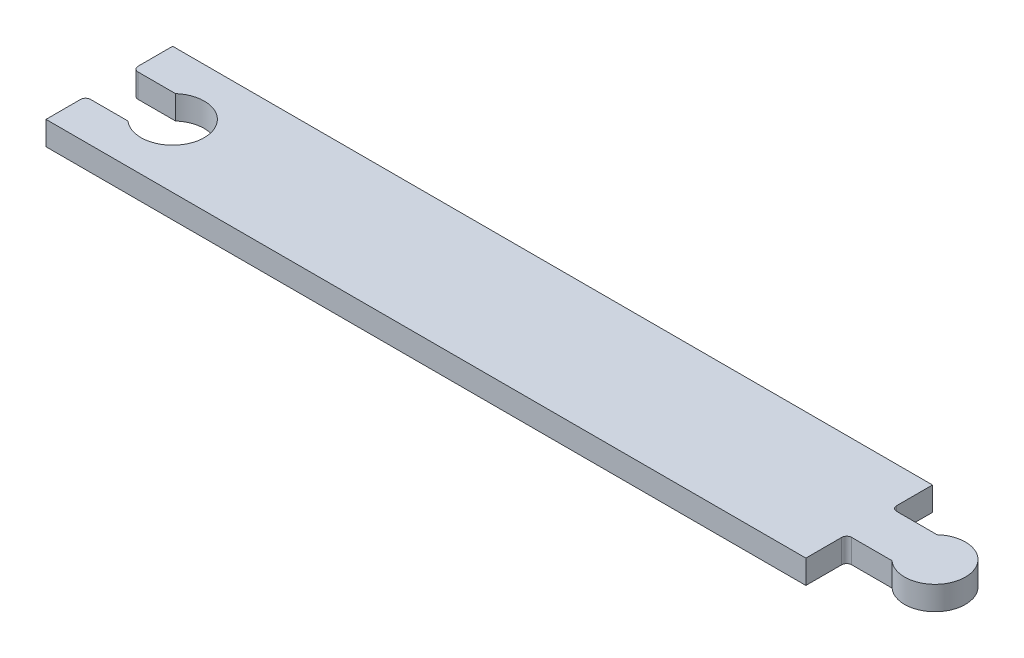
ISO-10303-21;
HEADER;
FILE_DESCRIPTION(('STEP AP214'),'2;1');
FILE_NAME('part.step','',(''),(''),'','','');
FILE_SCHEMA(('AUTOMOTIVE_DESIGN { 1 0 10303 214 1 1 1 1 }'));
ENDSEC;
DATA;
#1=APPLICATION_CONTEXT('core data for automotive mechanical design processes');
#2=APPLICATION_PROTOCOL_DEFINITION('international standard','automotive_design',2000,#1);
#3=PRODUCT_CONTEXT('',#1,'mechanical');
#4=PRODUCT('Part','Part','',(#3));
#5=PRODUCT_RELATED_PRODUCT_CATEGORY('part','',(#4));
#6=PRODUCT_DEFINITION_FORMATION('','',#4);
#7=PRODUCT_DEFINITION_CONTEXT('part definition',#1,'design');
#8=PRODUCT_DEFINITION('design','',#6,#7);
#9=PRODUCT_DEFINITION_SHAPE('','',#8);
#10=(LENGTH_UNIT() NAMED_UNIT(*) SI_UNIT(.MILLI.,.METRE.));
#11=(NAMED_UNIT(*) PLANE_ANGLE_UNIT() SI_UNIT($,.RADIAN.));
#12=(NAMED_UNIT(*) SI_UNIT($,.STERADIAN.) SOLID_ANGLE_UNIT());
#13=UNCERTAINTY_MEASURE_WITH_UNIT(LENGTH_MEASURE(1.E-05),#10,'distance_accuracy_value','');
#14=(GEOMETRIC_REPRESENTATION_CONTEXT(3) GLOBAL_UNCERTAINTY_ASSIGNED_CONTEXT((#13)) GLOBAL_UNIT_ASSIGNED_CONTEXT((#10,
#11,#12)) REPRESENTATION_CONTEXT('',''));
#15=CARTESIAN_POINT('',(0.,0.,0.));
#16=DIRECTION('',(0.,0.,1.));
#17=DIRECTION('',(1.,0.,0.));
#18=AXIS2_PLACEMENT_3D('',#15,#16,#17);
#19=CARTESIAN_POINT('',(76.2,4.7625,-4.5125));
#20=DIRECTION('',(-1.,0.,0.));
#21=DIRECTION('',(0.,0.,1.));
#22=AXIS2_PLACEMENT_3D('',#19,#20,#21);
#23=PLANE('',#22);
#24=DIRECTION('',(0.,0.,-1.));
#25=VECTOR('',#24,1.);
#26=CARTESIAN_POINT('',(76.2,4.7625,-4.5125));
#27=LINE('',#26,#25);
#28=CARTESIAN_POINT('',(76.2,4.7625,-5.5125));
#29=VERTEX_POINT('',#28);
#30=CARTESIAN_POINT('',(76.2,4.7625,-12.7));
#31=VERTEX_POINT('',#30);
#32=EDGE_CURVE('E145',#29,#31,#27,.T.);
#33=ORIENTED_EDGE('',*,*,#32,.F.);
#34=DIRECTION('',(0.,-1.,0.));
#35=VECTOR('',#34,1.);
#36=CARTESIAN_POINT('',(76.2,0.,-5.5125));
#37=LINE('',#36,#35);
#38=CARTESIAN_POINT('',(76.2,0.,-5.5125));
#39=VERTEX_POINT('',#38);
#40=EDGE_CURVE('E195',#29,#39,#37,.T.);
#41=ORIENTED_EDGE('',*,*,#40,.T.);
#42=DIRECTION('',(0.,0.,-1.));
#43=VECTOR('',#42,1.);
#44=CARTESIAN_POINT('',(76.2,0.,-4.5125));
#45=LINE('',#44,#43);
#46=CARTESIAN_POINT('',(76.2,0.,-12.7));
#47=VERTEX_POINT('',#46);
#48=EDGE_CURVE('E170',#39,#47,#45,.T.);
#49=ORIENTED_EDGE('',*,*,#48,.T.);
#50=DIRECTION('',(0.,-1.,0.));
#51=VECTOR('',#50,1.);
#52=CARTESIAN_POINT('',(76.2,4.7625,-12.7));
#53=LINE('',#52,#51);
#54=EDGE_CURVE('E163',#31,#47,#53,.T.);
#55=ORIENTED_EDGE('',*,*,#54,.F.);
#56=EDGE_LOOP('',(#33,#41,#49,#55));
#57=FACE_BOUND('',#56,.T.);
#58=ADVANCED_FACE('F33',(#57),#23,.F.);
#59=CARTESIAN_POINT('',(-76.2,4.7625,-12.7));
#60=DIRECTION('',(0.,0.,1.));
#61=DIRECTION('',(1.,0.,0.));
#62=AXIS2_PLACEMENT_3D('',#59,#60,#61);
#63=PLANE('',#62);
#64=DIRECTION('',(-1.,0.,0.));
#65=VECTOR('',#64,1.);
#66=CARTESIAN_POINT('',(-76.2,0.,-12.7));
#67=LINE('',#66,#65);
#68=CARTESIAN_POINT('',(-76.2,0.,-12.7));
#69=VERTEX_POINT('',#68);
#70=EDGE_CURVE('E245',#47,#69,#67,.T.);
#71=ORIENTED_EDGE('',*,*,#70,.T.);
#72=DIRECTION('',(0.,-1.,0.));
#73=VECTOR('',#72,1.);
#74=CARTESIAN_POINT('',(-76.2,4.7625,-12.7));
#75=LINE('',#74,#73);
#76=CARTESIAN_POINT('',(-76.2,4.7625,-12.7));
#77=VERTEX_POINT('',#76);
#78=EDGE_CURVE('E165',#77,#69,#75,.T.);
#79=ORIENTED_EDGE('',*,*,#78,.F.);
#80=DIRECTION('',(-1.,0.,0.));
#81=VECTOR('',#80,1.);
#82=CARTESIAN_POINT('',(-76.2,4.7625,-12.7));
#83=LINE('',#82,#81);
#84=EDGE_CURVE('E150',#31,#77,#83,.T.);
#85=ORIENTED_EDGE('',*,*,#84,.F.);
#86=ORIENTED_EDGE('',*,*,#54,.T.);
#87=EDGE_LOOP('',(#71,#79,#85,#86));
#88=FACE_BOUND('',#87,.T.);
#89=ADVANCED_FACE('F162',(#88),#63,.F.);
#90=CARTESIAN_POINT('',(-76.2,4.7625,-4.7625));
#91=DIRECTION('',(1.,0.,0.));
#92=DIRECTION('',(0.,0.,-1.));
#93=AXIS2_PLACEMENT_3D('',#90,#91,#92);
#94=PLANE('',#93);
#95=DIRECTION('',(0.,0.,1.));
#96=VECTOR('',#95,1.);
#97=CARTESIAN_POINT('',(-76.2,0.,-4.7625));
#98=LINE('',#97,#96);
#99=CARTESIAN_POINT('',(-76.2,0.,-5.7625));
#100=VERTEX_POINT('',#99);
#101=EDGE_CURVE('E247',#69,#100,#98,.T.);
#102=ORIENTED_EDGE('',*,*,#101,.T.);
#103=DIRECTION('',(0.,-1.,0.));
#104=VECTOR('',#103,1.);
#105=CARTESIAN_POINT('',(-76.2,4.7625,-5.7625));
#106=LINE('',#105,#104);
#107=CARTESIAN_POINT('',(-76.2,4.7625,-5.7625));
#108=VERTEX_POINT('',#107);
#109=EDGE_CURVE('E193',#100,#108,#106,.F.);
#110=ORIENTED_EDGE('',*,*,#109,.T.);
#111=DIRECTION('',(0.,0.,1.));
#112=VECTOR('',#111,1.);
#113=CARTESIAN_POINT('',(-76.2,4.7625,-4.7625));
#114=LINE('',#113,#112);
#115=EDGE_CURVE('E167',#77,#108,#114,.T.);
#116=ORIENTED_EDGE('',*,*,#115,.F.);
#117=ORIENTED_EDGE('',*,*,#78,.T.);
#118=EDGE_LOOP('',(#102,#110,#116,#117));
#119=FACE_BOUND('',#118,.T.);
#120=ADVANCED_FACE('F314',(#119),#94,.F.);
#121=CARTESIAN_POINT('',(-67.700130206315,4.7625,-4.7625));
#122=DIRECTION('',(0.,0.,-1.));
#123=DIRECTION('',(-1.,0.,0.));
#124=AXIS2_PLACEMENT_3D('',#121,#122,#123);
#125=PLANE('',#124);
#126=DIRECTION('',(1.,0.,0.));
#127=VECTOR('',#126,1.);
#128=CARTESIAN_POINT('',(-67.700130206315,4.7625,-4.7625));
#129=LINE('',#128,#127);
#130=CARTESIAN_POINT('',(-75.2,4.7625,-4.7625));
#131=VERTEX_POINT('',#130);
#132=CARTESIAN_POINT('',(-67.700130206315,4.7625,-4.7625));
#133=VERTEX_POINT('',#132);
#134=EDGE_CURVE('E304',#131,#133,#129,.T.);
#135=ORIENTED_EDGE('',*,*,#134,.F.);
#136=DIRECTION('',(0.,-1.,0.));
#137=VECTOR('',#136,1.);
#138=CARTESIAN_POINT('',(-75.2,4.7625,-4.7625));
#139=LINE('',#138,#137);
#140=CARTESIAN_POINT('',(-75.2,0.,-4.7625));
#141=VERTEX_POINT('',#140);
#142=EDGE_CURVE('E190',#131,#141,#139,.T.);
#143=ORIENTED_EDGE('',*,*,#142,.T.);
#144=DIRECTION('',(1.,0.,0.));
#145=VECTOR('',#144,1.);
#146=CARTESIAN_POINT('',(-67.700130206315,0.,-4.7625));
#147=LINE('',#146,#145);
#148=CARTESIAN_POINT('',(-67.700130206315,0.,-4.7625));
#149=VERTEX_POINT('',#148);
#150=EDGE_CURVE('E250',#141,#149,#147,.T.);
#151=ORIENTED_EDGE('',*,*,#150,.T.);
#152=DIRECTION('',(0.,-1.,0.));
#153=VECTOR('',#152,1.);
#154=CARTESIAN_POINT('',(-67.700130206315,4.7625,-4.7625));
#155=LINE('',#154,#153);
#156=EDGE_CURVE('E177',#133,#149,#155,.T.);
#157=ORIENTED_EDGE('',*,*,#156,.F.);
#158=EDGE_LOOP('',(#135,#143,#151,#157));
#159=FACE_BOUND('',#158,.T.);
#160=ADVANCED_FACE('F312',(#159),#125,.F.);
#161=CARTESIAN_POINT('',(-63.5,4.7625,0.));
#162=DIRECTION('',(0.,-1.,0.));
#163=DIRECTION('',(0.,0.,-1.));
#164=AXIS2_PLACEMENT_3D('',#161,#162,#163);
#165=CYLINDRICAL_SURFACE('',#164,6.35);
#166=CARTESIAN_POINT('',(-63.5,0.,0.));
#167=DIRECTION('',(0.,-1.,0.));
#168=DIRECTION('',(0.,0.,1.));
#169=AXIS2_PLACEMENT_3D('',#166,#167,#168);
#170=CIRCLE('',#169,6.35);
#171=CARTESIAN_POINT('',(-67.700130206315,0.,4.7625));
#172=VERTEX_POINT('',#171);
#173=EDGE_CURVE('E252',#149,#172,#170,.T.);
#174=ORIENTED_EDGE('',*,*,#173,.T.);
#175=DIRECTION('',(0.,-1.,0.));
#176=VECTOR('',#175,1.);
#177=CARTESIAN_POINT('',(-67.700130206315,4.7625,4.7625));
#178=LINE('',#177,#176);
#179=CARTESIAN_POINT('',(-67.700130206315,4.7625,4.7625));
#180=VERTEX_POINT('',#179);
#181=EDGE_CURVE('E271',#180,#172,#178,.T.);
#182=ORIENTED_EDGE('',*,*,#181,.F.);
#183=CARTESIAN_POINT('',(-63.5,4.7625,0.));
#184=DIRECTION('',(0.,-1.,0.));
#185=DIRECTION('',(0.,0.,1.));
#186=AXIS2_PLACEMENT_3D('',#183,#184,#185);
#187=CIRCLE('',#186,6.35);
#188=EDGE_CURVE('E280',#133,#180,#187,.T.);
#189=ORIENTED_EDGE('',*,*,#188,.F.);
#190=ORIENTED_EDGE('',*,*,#156,.T.);
#191=EDGE_LOOP('',(#174,#182,#189,#190));
#192=FACE_BOUND('',#191,.T.);
#193=ADVANCED_FACE('F278',(#192),#165,.F.);
#194=CARTESIAN_POINT('',(-76.2,4.7625,4.7625));
#195=DIRECTION('',(0.,0.,1.));
#196=DIRECTION('',(1.,0.,0.));
#197=AXIS2_PLACEMENT_3D('',#194,#195,#196);
#198=PLANE('',#197);
#199=DIRECTION('',(-1.,0.,0.));
#200=VECTOR('',#199,1.);
#201=CARTESIAN_POINT('',(-76.2,0.,4.7625));
#202=LINE('',#201,#200);
#203=CARTESIAN_POINT('',(-75.2,0.,4.7625));
#204=VERTEX_POINT('',#203);
#205=EDGE_CURVE('E254',#172,#204,#202,.T.);
#206=ORIENTED_EDGE('',*,*,#205,.T.);
#207=DIRECTION('',(0.,-1.,0.));
#208=VECTOR('',#207,1.);
#209=CARTESIAN_POINT('',(-75.2,4.7625,4.7625));
#210=LINE('',#209,#208);
#211=CARTESIAN_POINT('',(-75.2,4.7625,4.7625));
#212=VERTEX_POINT('',#211);
#213=EDGE_CURVE('E184',#204,#212,#210,.F.);
#214=ORIENTED_EDGE('',*,*,#213,.T.);
#215=DIRECTION('',(-1.,0.,0.));
#216=VECTOR('',#215,1.);
#217=CARTESIAN_POINT('',(-76.2,4.7625,4.7625));
#218=LINE('',#217,#216);
#219=EDGE_CURVE('E296',#180,#212,#218,.T.);
#220=ORIENTED_EDGE('',*,*,#219,.F.);
#221=ORIENTED_EDGE('',*,*,#181,.T.);
#222=EDGE_LOOP('',(#206,#214,#220,#221));
#223=FACE_BOUND('',#222,.T.);
#224=ADVANCED_FACE('F287',(#223),#198,.F.);
#225=CARTESIAN_POINT('',(-76.2,4.7625,12.7));
#226=DIRECTION('',(1.,0.,0.));
#227=DIRECTION('',(0.,0.,-1.));
#228=AXIS2_PLACEMENT_3D('',#225,#226,#227);
#229=PLANE('',#228);
#230=DIRECTION('',(0.,0.,1.));
#231=VECTOR('',#230,1.);
#232=CARTESIAN_POINT('',(-76.2,4.7625,12.7));
#233=LINE('',#232,#231);
#234=CARTESIAN_POINT('',(-76.2,4.7625,5.7625));
#235=VERTEX_POINT('',#234);
#236=CARTESIAN_POINT('',(-76.2,4.7625,12.7));
#237=VERTEX_POINT('',#236);
#238=EDGE_CURVE('E294',#235,#237,#233,.T.);
#239=ORIENTED_EDGE('',*,*,#238,.F.);
#240=DIRECTION('',(0.,-1.,0.));
#241=VECTOR('',#240,1.);
#242=CARTESIAN_POINT('',(-76.2,4.7625,5.7625));
#243=LINE('',#242,#241);
#244=CARTESIAN_POINT('',(-76.2,0.,5.7625));
#245=VERTEX_POINT('',#244);
#246=EDGE_CURVE('E172',#235,#245,#243,.T.);
#247=ORIENTED_EDGE('',*,*,#246,.T.);
#248=DIRECTION('',(0.,0.,1.));
#249=VECTOR('',#248,1.);
#250=CARTESIAN_POINT('',(-76.2,0.,12.7));
#251=LINE('',#250,#249);
#252=CARTESIAN_POINT('',(-76.2,0.,12.7));
#253=VERTEX_POINT('',#252);
#254=EDGE_CURVE('E257',#245,#253,#251,.T.);
#255=ORIENTED_EDGE('',*,*,#254,.T.);
#256=DIRECTION('',(0.,-1.,0.));
#257=VECTOR('',#256,1.);
#258=CARTESIAN_POINT('',(-76.2,4.7625,12.7));
#259=LINE('',#258,#257);
#260=EDGE_CURVE('E268',#237,#253,#259,.T.);
#261=ORIENTED_EDGE('',*,*,#260,.F.);
#262=EDGE_LOOP('',(#239,#247,#255,#261));
#263=FACE_BOUND('',#262,.T.);
#264=ADVANCED_FACE('F298',(#263),#229,.F.);
#265=CARTESIAN_POINT('',(-76.2,4.7625,12.7));
#266=DIRECTION('',(0.,0.,-1.));
#267=DIRECTION('',(-1.,0.,0.));
#268=AXIS2_PLACEMENT_3D('',#265,#266,#267);
#269=PLANE('',#268);
#270=DIRECTION('',(1.,0.,0.));
#271=VECTOR('',#270,1.);
#272=CARTESIAN_POINT('',(-76.2,0.,12.7));
#273=LINE('',#272,#271);
#274=CARTESIAN_POINT('',(76.2,0.,12.7));
#275=VERTEX_POINT('',#274);
#276=EDGE_CURVE('E224',#253,#275,#273,.T.);
#277=ORIENTED_EDGE('',*,*,#276,.T.);
#278=DIRECTION('',(0.,-1.,0.));
#279=VECTOR('',#278,1.);
#280=CARTESIAN_POINT('',(76.2,4.7625,12.7));
#281=LINE('',#280,#279);
#282=CARTESIAN_POINT('',(76.2,4.7625,12.7));
#283=VERTEX_POINT('',#282);
#284=EDGE_CURVE('E223',#283,#275,#281,.T.);
#285=ORIENTED_EDGE('',*,*,#284,.F.);
#286=DIRECTION('',(1.,0.,0.));
#287=VECTOR('',#286,1.);
#288=CARTESIAN_POINT('',(-76.2,4.7625,12.7));
#289=LINE('',#288,#287);
#290=EDGE_CURVE('E238',#237,#283,#289,.T.);
#291=ORIENTED_EDGE('',*,*,#290,.F.);
#292=ORIENTED_EDGE('',*,*,#260,.T.);
#293=EDGE_LOOP('',(#277,#285,#291,#292));
#294=FACE_BOUND('',#293,.T.);
#295=ADVANCED_FACE('F356',(#294),#269,.F.);
#296=CARTESIAN_POINT('',(76.2,4.7625,12.7));
#297=DIRECTION('',(-1.,0.,0.));
#298=DIRECTION('',(0.,0.,1.));
#299=AXIS2_PLACEMENT_3D('',#296,#297,#298);
#300=PLANE('',#299);
#301=DIRECTION('',(0.,0.,-1.));
#302=VECTOR('',#301,1.);
#303=CARTESIAN_POINT('',(76.2,0.,12.7));
#304=LINE('',#303,#302);
#305=CARTESIAN_POINT('',(76.2,0.,5.5125));
#306=VERTEX_POINT('',#305);
#307=EDGE_CURVE('E212',#275,#306,#304,.T.);
#308=ORIENTED_EDGE('',*,*,#307,.T.);
#309=DIRECTION('',(0.,-1.,0.));
#310=VECTOR('',#309,1.);
#311=CARTESIAN_POINT('',(76.2,4.7625,5.5125));
#312=LINE('',#311,#310);
#313=CARTESIAN_POINT('',(76.2,4.7625,5.5125));
#314=VERTEX_POINT('',#313);
#315=EDGE_CURVE('E201',#306,#314,#312,.F.);
#316=ORIENTED_EDGE('',*,*,#315,.T.);
#317=DIRECTION('',(0.,0.,-1.));
#318=VECTOR('',#317,1.);
#319=CARTESIAN_POINT('',(76.2,4.7625,12.7));
#320=LINE('',#319,#318);
#321=EDGE_CURVE('E234',#283,#314,#320,.T.);
#322=ORIENTED_EDGE('',*,*,#321,.F.);
#323=ORIENTED_EDGE('',*,*,#284,.T.);
#324=EDGE_LOOP('',(#308,#316,#322,#323));
#325=FACE_BOUND('',#324,.T.);
#326=ADVANCED_FACE('F220',(#325),#300,.F.);
#327=CARTESIAN_POINT('',(76.2,4.7625,4.5125));
#328=DIRECTION('',(0.,0.,-1.));
#329=DIRECTION('',(-1.,0.,0.));
#330=AXIS2_PLACEMENT_3D('',#327,#328,#329);
#331=PLANE('',#330);
#332=DIRECTION('',(1.,0.,0.));
#333=VECTOR('',#332,1.);
#334=CARTESIAN_POINT('',(76.2,4.7625,4.5125));
#335=LINE('',#334,#333);
#336=CARTESIAN_POINT('',(77.2,4.7625,4.5125));
#337=VERTEX_POINT('',#336);
#338=CARTESIAN_POINT('',(85.2954484106056,4.7625,4.5125));
#339=VERTEX_POINT('',#338);
#340=EDGE_CURVE('E230',#337,#339,#335,.T.);
#341=ORIENTED_EDGE('',*,*,#340,.F.);
#342=DIRECTION('',(0.,-1.,0.));
#343=VECTOR('',#342,1.);
#344=CARTESIAN_POINT('',(77.2,0.,4.5125));
#345=LINE('',#344,#343);
#346=CARTESIAN_POINT('',(77.2,0.,4.5125));
#347=VERTEX_POINT('',#346);
#348=EDGE_CURVE('E198',#337,#347,#345,.T.);
#349=ORIENTED_EDGE('',*,*,#348,.T.);
#350=DIRECTION('',(1.,0.,0.));
#351=VECTOR('',#350,1.);
#352=CARTESIAN_POINT('',(76.2,0.,4.5125));
#353=LINE('',#352,#351);
#354=CARTESIAN_POINT('',(85.2954484106056,0.,4.5125));
#355=VERTEX_POINT('',#354);
#356=EDGE_CURVE('E214',#347,#355,#353,.T.);
#357=ORIENTED_EDGE('',*,*,#356,.T.);
#358=DIRECTION('',(0.,-1.,0.));
#359=VECTOR('',#358,1.);
#360=CARTESIAN_POINT('',(85.2954484106056,4.7625,4.5125));
#361=LINE('',#360,#359);
#362=EDGE_CURVE('E231',#339,#355,#361,.T.);
#363=ORIENTED_EDGE('',*,*,#362,.F.);
#364=EDGE_LOOP('',(#341,#349,#357,#363));
#365=FACE_BOUND('',#364,.T.);
#366=ADVANCED_FACE('F227',(#365),#331,.F.);
#367=CARTESIAN_POINT('',(89.4,4.7625,0.));
#368=DIRECTION('',(0.,-1.,0.));
#369=DIRECTION('',(0.,0.,-1.));
#370=AXIS2_PLACEMENT_3D('',#367,#368,#369);
#371=CYLINDRICAL_SURFACE('',#370,6.1);
#372=CARTESIAN_POINT('',(89.4,0.,0.));
#373=DIRECTION('',(0.,1.,0.));
#374=DIRECTION('',(0.,0.,1.));
#375=AXIS2_PLACEMENT_3D('',#372,#373,#374);
#376=CIRCLE('',#375,6.1);
#377=CARTESIAN_POINT('',(85.2954484106056,0.,-4.5125));
#378=VERTEX_POINT('',#377);
#379=EDGE_CURVE('E261',#355,#378,#376,.T.);
#380=ORIENTED_EDGE('',*,*,#379,.T.);
#381=DIRECTION('',(0.,-1.,0.));
#382=VECTOR('',#381,1.);
#383=CARTESIAN_POINT('',(85.2954484106056,4.7625,-4.5125));
#384=LINE('',#383,#382);
#385=CARTESIAN_POINT('',(85.2954484106056,4.7625,-4.5125));
#386=VERTEX_POINT('',#385);
#387=EDGE_CURVE('E243',#386,#378,#384,.T.);
#388=ORIENTED_EDGE('',*,*,#387,.F.);
#389=CARTESIAN_POINT('',(89.4,4.7625,0.));
#390=DIRECTION('',(0.,1.,0.));
#391=DIRECTION('',(0.,0.,1.));
#392=AXIS2_PLACEMENT_3D('',#389,#390,#391);
#393=CIRCLE('',#392,6.1);
#394=EDGE_CURVE('E233',#339,#386,#393,.T.);
#395=ORIENTED_EDGE('',*,*,#394,.F.);
#396=ORIENTED_EDGE('',*,*,#362,.T.);
#397=EDGE_LOOP('',(#380,#388,#395,#396));
#398=FACE_BOUND('',#397,.T.);
#399=ADVANCED_FACE('F343',(#398),#371,.T.);
#400=CARTESIAN_POINT('',(76.2,4.7625,-4.5125));
#401=DIRECTION('',(0.,0.,1.));
#402=DIRECTION('',(1.,0.,0.));
#403=AXIS2_PLACEMENT_3D('',#400,#401,#402);
#404=PLANE('',#403);
#405=DIRECTION('',(-1.,0.,0.));
#406=VECTOR('',#405,1.);
#407=CARTESIAN_POINT('',(76.2,0.,-4.5125));
#408=LINE('',#407,#406);
#409=CARTESIAN_POINT('',(77.2,0.,-4.5125));
#410=VERTEX_POINT('',#409);
#411=EDGE_CURVE('E158',#378,#410,#408,.T.);
#412=ORIENTED_EDGE('',*,*,#411,.T.);
#413=DIRECTION('',(0.,-1.,0.));
#414=VECTOR('',#413,1.);
#415=CARTESIAN_POINT('',(77.2,4.7625,-4.5125));
#416=LINE('',#415,#414);
#417=CARTESIAN_POINT('',(77.2,4.7625,-4.5125));
#418=VERTEX_POINT('',#417);
#419=EDGE_CURVE('E48',#410,#418,#416,.F.);
#420=ORIENTED_EDGE('',*,*,#419,.T.);
#421=DIRECTION('',(-1.,0.,0.));
#422=VECTOR('',#421,1.);
#423=CARTESIAN_POINT('',(76.2,4.7625,-4.5125));
#424=LINE('',#423,#422);
#425=EDGE_CURVE('E236',#386,#418,#424,.T.);
#426=ORIENTED_EDGE('',*,*,#425,.F.);
#427=ORIENTED_EDGE('',*,*,#387,.T.);
#428=EDGE_LOOP('',(#412,#420,#426,#427));
#429=FACE_BOUND('',#428,.T.);
#430=ADVANCED_FACE('F340',(#429),#404,.F.);
#431=CARTESIAN_POINT('',(-63.5,4.7625,0.));
#432=DIRECTION('',(0.,1.,0.));
#433=DIRECTION('',(0.,0.,1.));
#434=AXIS2_PLACEMENT_3D('',#431,#432,#433);
#435=PLANE('',#434);
#436=ORIENTED_EDGE('',*,*,#219,.T.);
#437=CARTESIAN_POINT('',(-75.2,4.7625,5.7625));
#438=DIRECTION('',(0.,1.,0.));
#439=DIRECTION('',(0.,0.,1.));
#440=AXIS2_PLACEMENT_3D('',#437,#438,#439);
#441=CIRCLE('',#440,1.);
#442=EDGE_CURVE('E188',#212,#235,#441,.T.);
#443=ORIENTED_EDGE('',*,*,#442,.T.);
#444=ORIENTED_EDGE('',*,*,#238,.T.);
#445=ORIENTED_EDGE('',*,*,#290,.T.);
#446=ORIENTED_EDGE('',*,*,#321,.T.);
#447=CARTESIAN_POINT('',(77.2,4.7625,5.5125));
#448=DIRECTION('',(0.,1.,0.));
#449=DIRECTION('',(0.,0.,1.));
#450=AXIS2_PLACEMENT_3D('',#447,#448,#449);
#451=CIRCLE('',#450,1.);
#452=EDGE_CURVE('E11',#314,#337,#451,.F.);
#453=ORIENTED_EDGE('',*,*,#452,.T.);
#454=ORIENTED_EDGE('',*,*,#340,.T.);
#455=ORIENTED_EDGE('',*,*,#394,.T.);
#456=ORIENTED_EDGE('',*,*,#425,.T.);
#457=CARTESIAN_POINT('',(77.2,4.7625,-5.5125));
#458=DIRECTION('',(0.,1.,0.));
#459=DIRECTION('',(0.,0.,1.));
#460=AXIS2_PLACEMENT_3D('',#457,#458,#459);
#461=CIRCLE('',#460,1.);
#462=EDGE_CURVE('E153',#418,#29,#461,.F.);
#463=ORIENTED_EDGE('',*,*,#462,.T.);
#464=ORIENTED_EDGE('',*,*,#32,.T.);
#465=ORIENTED_EDGE('',*,*,#84,.T.);
#466=ORIENTED_EDGE('',*,*,#115,.T.);
#467=CARTESIAN_POINT('',(-75.2,4.7625,-5.7625));
#468=DIRECTION('',(0.,1.,0.));
#469=DIRECTION('',(0.,0.,1.));
#470=AXIS2_PLACEMENT_3D('',#467,#468,#469);
#471=CIRCLE('',#470,1.);
#472=EDGE_CURVE('E186',#108,#131,#471,.T.);
#473=ORIENTED_EDGE('',*,*,#472,.T.);
#474=ORIENTED_EDGE('',*,*,#134,.T.);
#475=ORIENTED_EDGE('',*,*,#188,.T.);
#476=EDGE_LOOP('',(#436,#443,#444,#445,#446,#453,#454,#455,#456,#463,#464,#465,#466,#473,#474,#475));
#477=FACE_BOUND('',#476,.T.);
#478=ADVANCED_FACE('F148',(#477),#435,.T.);
#479=CARTESIAN_POINT('',(-63.5,0.,0.));
#480=DIRECTION('',(0.,1.,0.));
#481=DIRECTION('',(0.,0.,1.));
#482=AXIS2_PLACEMENT_3D('',#479,#480,#481);
#483=PLANE('',#482);
#484=ORIENTED_EDGE('',*,*,#254,.F.);
#485=CARTESIAN_POINT('',(-75.2,0.,5.7625));
#486=DIRECTION('',(0.,1.,0.));
#487=DIRECTION('',(0.,0.,1.));
#488=AXIS2_PLACEMENT_3D('',#485,#486,#487);
#489=CIRCLE('',#488,1.);
#490=EDGE_CURVE('E182',#245,#204,#489,.F.);
#491=ORIENTED_EDGE('',*,*,#490,.T.);
#492=ORIENTED_EDGE('',*,*,#205,.F.);
#493=ORIENTED_EDGE('',*,*,#173,.F.);
#494=ORIENTED_EDGE('',*,*,#150,.F.);
#495=CARTESIAN_POINT('',(-75.2,0.,-5.7625));
#496=DIRECTION('',(0.,1.,0.));
#497=DIRECTION('',(0.,0.,1.));
#498=AXIS2_PLACEMENT_3D('',#495,#496,#497);
#499=CIRCLE('',#498,1.);
#500=EDGE_CURVE('E175',#141,#100,#499,.F.);
#501=ORIENTED_EDGE('',*,*,#500,.T.);
#502=ORIENTED_EDGE('',*,*,#101,.F.);
#503=ORIENTED_EDGE('',*,*,#70,.F.);
#504=ORIENTED_EDGE('',*,*,#48,.F.);
#505=CARTESIAN_POINT('',(77.2,0.,-5.5125));
#506=DIRECTION('',(0.,1.,0.));
#507=DIRECTION('',(0.,0.,1.));
#508=AXIS2_PLACEMENT_3D('',#505,#506,#507);
#509=CIRCLE('',#508,1.);
#510=EDGE_CURVE('E203',#39,#410,#509,.T.);
#511=ORIENTED_EDGE('',*,*,#510,.T.);
#512=ORIENTED_EDGE('',*,*,#411,.F.);
#513=ORIENTED_EDGE('',*,*,#379,.F.);
#514=ORIENTED_EDGE('',*,*,#356,.F.);
#515=CARTESIAN_POINT('',(77.2,0.,5.5125));
#516=DIRECTION('',(0.,1.,0.));
#517=DIRECTION('',(0.,0.,1.));
#518=AXIS2_PLACEMENT_3D('',#515,#516,#517);
#519=CIRCLE('',#518,1.);
#520=EDGE_CURVE('E41',#347,#306,#519,.T.);
#521=ORIENTED_EDGE('',*,*,#520,.T.);
#522=ORIENTED_EDGE('',*,*,#307,.F.);
#523=ORIENTED_EDGE('',*,*,#276,.F.);
#524=EDGE_LOOP('',(#484,#491,#492,#493,#494,#501,#502,#503,#504,#511,#512,#513,#514,#521,#522,#523));
#525=FACE_BOUND('',#524,.T.);
#526=ADVANCED_FACE('F210',(#525),#483,.F.);
#527=CARTESIAN_POINT('',(-75.2,4.7625,5.7625));
#528=DIRECTION('',(0.,-1.,0.));
#529=DIRECTION('',(0.,0.,-1.));
#530=AXIS2_PLACEMENT_3D('',#527,#528,#529);
#531=CYLINDRICAL_SURFACE('',#530,1.);
#532=ORIENTED_EDGE('',*,*,#442,.F.);
#533=ORIENTED_EDGE('',*,*,#213,.F.);
#534=ORIENTED_EDGE('',*,*,#490,.F.);
#535=ORIENTED_EDGE('',*,*,#246,.F.);
#536=EDGE_LOOP('',(#532,#533,#534,#535));
#537=FACE_BOUND('',#536,.T.);
#538=ADVANCED_FACE('F291',(#537),#531,.T.);
#539=CARTESIAN_POINT('',(-75.2,4.7625,-5.7625));
#540=DIRECTION('',(0.,-1.,0.));
#541=DIRECTION('',(0.,0.,-1.));
#542=AXIS2_PLACEMENT_3D('',#539,#540,#541);
#543=CYLINDRICAL_SURFACE('',#542,1.);
#544=ORIENTED_EDGE('',*,*,#472,.F.);
#545=ORIENTED_EDGE('',*,*,#109,.F.);
#546=ORIENTED_EDGE('',*,*,#500,.F.);
#547=ORIENTED_EDGE('',*,*,#142,.F.);
#548=EDGE_LOOP('',(#544,#545,#546,#547));
#549=FACE_BOUND('',#548,.T.);
#550=ADVANCED_FACE('F311',(#549),#543,.T.);
#551=CARTESIAN_POINT('',(77.2,4.7625,-5.5125));
#552=DIRECTION('',(0.,1.,0.));
#553=DIRECTION('',(0.,0.,1.));
#554=AXIS2_PLACEMENT_3D('',#551,#552,#553);
#555=CYLINDRICAL_SURFACE('',#554,1.);
#556=ORIENTED_EDGE('',*,*,#462,.F.);
#557=ORIENTED_EDGE('',*,*,#419,.F.);
#558=ORIENTED_EDGE('',*,*,#510,.F.);
#559=ORIENTED_EDGE('',*,*,#40,.F.);
#560=EDGE_LOOP('',(#556,#557,#558,#559));
#561=FACE_BOUND('',#560,.T.);
#562=ADVANCED_FACE('F332',(#561),#555,.F.);
#563=CARTESIAN_POINT('',(77.2,4.7625,5.5125));
#564=DIRECTION('',(0.,1.,0.));
#565=DIRECTION('',(0.,0.,1.));
#566=AXIS2_PLACEMENT_3D('',#563,#564,#565);
#567=CYLINDRICAL_SURFACE('',#566,1.);
#568=ORIENTED_EDGE('',*,*,#452,.F.);
#569=ORIENTED_EDGE('',*,*,#315,.F.);
#570=ORIENTED_EDGE('',*,*,#520,.F.);
#571=ORIENTED_EDGE('',*,*,#348,.F.);
#572=EDGE_LOOP('',(#568,#569,#570,#571));
#573=FACE_BOUND('',#572,.T.);
#574=ADVANCED_FACE('F35',(#573),#567,.F.);
#575=CLOSED_SHELL('',(#58,#89,#120,#160,#193,#224,#264,#295,#326,#366,#399,#430,#478,#526,#538,
#550,#562,#574));
#576=MANIFOLD_SOLID_BREP('B2',#575);
#577=ADVANCED_BREP_SHAPE_REPRESENTATION('',(#18,#576),#14);
#578=SHAPE_DEFINITION_REPRESENTATION(#9,#577);
ENDSEC;
END-ISO-10303-21;
